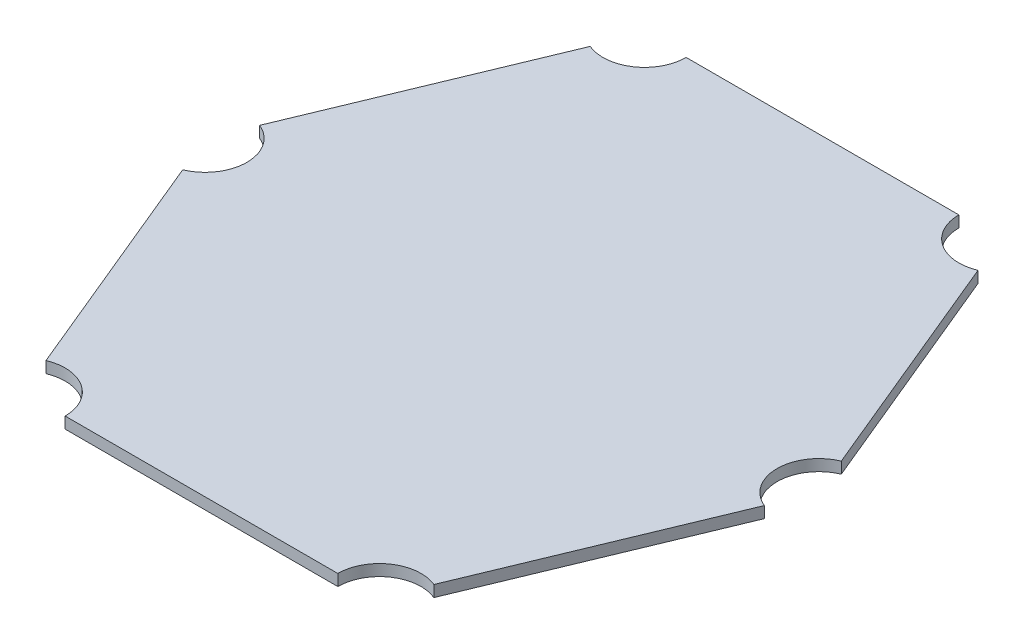
ISO-10303-21;
HEADER;
FILE_DESCRIPTION(('STEP AP214'),'2;1');
FILE_NAME('part.step','',(''),(''),'','','');
FILE_SCHEMA(('AUTOMOTIVE_DESIGN { 1 0 10303 214 1 1 1 1 }'));
ENDSEC;
DATA;
#1=APPLICATION_CONTEXT('core data for automotive mechanical design processes');
#2=APPLICATION_PROTOCOL_DEFINITION('international standard','automotive_design',2000,#1);
#3=PRODUCT_CONTEXT('',#1,'mechanical');
#4=PRODUCT('Part','Part','',(#3));
#5=PRODUCT_RELATED_PRODUCT_CATEGORY('part','',(#4));
#6=PRODUCT_DEFINITION_FORMATION('','',#4);
#7=PRODUCT_DEFINITION_CONTEXT('part definition',#1,'design');
#8=PRODUCT_DEFINITION('design','',#6,#7);
#9=PRODUCT_DEFINITION_SHAPE('','',#8);
#10=(LENGTH_UNIT() NAMED_UNIT(*) SI_UNIT(.MILLI.,.METRE.));
#11=(NAMED_UNIT(*) PLANE_ANGLE_UNIT() SI_UNIT($,.RADIAN.));
#12=(NAMED_UNIT(*) SI_UNIT($,.STERADIAN.) SOLID_ANGLE_UNIT());
#13=UNCERTAINTY_MEASURE_WITH_UNIT(LENGTH_MEASURE(1.E-05),#10,'distance_accuracy_value','');
#14=(GEOMETRIC_REPRESENTATION_CONTEXT(3) GLOBAL_UNCERTAINTY_ASSIGNED_CONTEXT((#13)) GLOBAL_UNIT_ASSIGNED_CONTEXT((#10,
#11,#12)) REPRESENTATION_CONTEXT('',''));
#15=CARTESIAN_POINT('',(0.,0.,0.));
#16=DIRECTION('',(0.,0.,1.));
#17=DIRECTION('',(1.,0.,0.));
#18=AXIS2_PLACEMENT_3D('',#15,#16,#17);
#19=CARTESIAN_POINT('',(47.,3.,82.));
#20=DIRECTION('',(-0.923742113571632,0.,-0.383015022700433));
#21=DIRECTION('',(-0.383015022700433,0.,0.923742113571632));
#22=AXIS2_PLACEMENT_3D('',#19,#20,#21);
#23=PLANE('',#22);
#24=DIRECTION('',(0.383015022700433,0.,-0.923742113571632));
#25=VECTOR('',#24,1.);
#26=CARTESIAN_POINT('',(47.,3.,82.));
#27=LINE('',#26,#25);
#28=CARTESIAN_POINT('',(51.2131652497048,3.,71.838836750712));
#29=VERTEX_POINT('',#28);
#30=CARTESIAN_POINT('',(76.7868347502953,3.,10.1611632492879));
#31=VERTEX_POINT('',#30);
#32=EDGE_CURVE('E168',#29,#31,#27,.T.);
#33=ORIENTED_EDGE('',*,*,#32,.F.);
#34=DIRECTION('',(0.,1.,0.));
#35=VECTOR('',#34,1.);
#36=CARTESIAN_POINT('',(51.2131652497048,0.,71.838836750712));
#37=LINE('',#36,#35);
#38=CARTESIAN_POINT('',(51.2131652497048,0.,71.838836750712));
#39=VERTEX_POINT('',#38);
#40=EDGE_CURVE('E207',#29,#39,#37,.F.);
#41=ORIENTED_EDGE('',*,*,#40,.T.);
#42=DIRECTION('',(0.383015022700433,0.,-0.923742113571632));
#43=VECTOR('',#42,1.);
#44=CARTESIAN_POINT('',(47.,0.,82.));
#45=LINE('',#44,#43);
#46=CARTESIAN_POINT('',(76.7868347502953,0.,10.1611632492879));
#47=VERTEX_POINT('',#46);
#48=EDGE_CURVE('E152',#39,#47,#45,.T.);
#49=ORIENTED_EDGE('',*,*,#48,.T.);
#50=DIRECTION('',(0.,1.,0.));
#51=VECTOR('',#50,1.);
#52=CARTESIAN_POINT('',(76.7868347502953,0.,10.1611632492879));
#53=LINE('',#52,#51);
#54=EDGE_CURVE('E131',#47,#31,#53,.T.);
#55=ORIENTED_EDGE('',*,*,#54,.T.);
#56=EDGE_LOOP('',(#33,#41,#49,#55));
#57=FACE_BOUND('',#56,.T.);
#58=ADVANCED_FACE('F39',(#57),#23,.F.);
#59=CARTESIAN_POINT('',(47.,3.,-82.));
#60=DIRECTION('',(-0.923742113571632,0.,0.383015022700433));
#61=DIRECTION('',(0.383015022700433,0.,0.923742113571632));
#62=AXIS2_PLACEMENT_3D('',#59,#60,#61);
#63=PLANE('',#62);
#64=DIRECTION('',(-0.383015022700433,0.,-0.923742113571632));
#65=VECTOR('',#64,1.);
#66=CARTESIAN_POINT('',(47.,0.,-82.));
#67=LINE('',#66,#65);
#68=CARTESIAN_POINT('',(76.7868347502953,0.,-10.1611632492879));
#69=VERTEX_POINT('',#68);
#70=CARTESIAN_POINT('',(51.2131652497048,0.,-71.838836750712));
#71=VERTEX_POINT('',#70);
#72=EDGE_CURVE('E143',#69,#71,#67,.T.);
#73=ORIENTED_EDGE('',*,*,#72,.T.);
#74=DIRECTION('',(0.,1.,0.));
#75=VECTOR('',#74,1.);
#76=CARTESIAN_POINT('',(51.2131652497048,0.,-71.838836750712));
#77=LINE('',#76,#75);
#78=CARTESIAN_POINT('',(51.2131652497048,3.,-71.838836750712));
#79=VERTEX_POINT('',#78);
#80=EDGE_CURVE('E52',#71,#79,#77,.T.);
#81=ORIENTED_EDGE('',*,*,#80,.T.);
#82=DIRECTION('',(-0.383015022700433,0.,-0.923742113571632));
#83=VECTOR('',#82,1.);
#84=CARTESIAN_POINT('',(47.,3.,-82.));
#85=LINE('',#84,#83);
#86=CARTESIAN_POINT('',(76.7868347502953,3.,-10.1611632492879));
#87=VERTEX_POINT('',#86);
#88=EDGE_CURVE('E145',#87,#79,#85,.T.);
#89=ORIENTED_EDGE('',*,*,#88,.F.);
#90=DIRECTION('',(0.,1.,0.));
#91=VECTOR('',#90,1.);
#92=CARTESIAN_POINT('',(76.7868347502953,0.,-10.1611632492879));
#93=LINE('',#92,#91);
#94=EDGE_CURVE('E128',#87,#69,#93,.F.);
#95=ORIENTED_EDGE('',*,*,#94,.T.);
#96=EDGE_LOOP('',(#73,#81,#89,#95));
#97=FACE_BOUND('',#96,.T.);
#98=ADVANCED_FACE('F142',(#97),#63,.F.);
#99=CARTESIAN_POINT('',(-47.,3.,-82.));
#100=DIRECTION('',(0.,0.,1.));
#101=DIRECTION('',(1.,0.,0.));
#102=AXIS2_PLACEMENT_3D('',#99,#100,#101);
#103=PLANE('',#102);
#104=DIRECTION('',(-1.,0.,0.));
#105=VECTOR('',#104,1.);
#106=CARTESIAN_POINT('',(-47.,3.,-82.));
#107=LINE('',#106,#105);
#108=CARTESIAN_POINT('',(36.,3.,-82.));
#109=VERTEX_POINT('',#108);
#110=CARTESIAN_POINT('',(-36.,3.,-82.));
#111=VERTEX_POINT('',#110);
#112=EDGE_CURVE('E183',#109,#111,#107,.T.);
#113=ORIENTED_EDGE('',*,*,#112,.F.);
#114=DIRECTION('',(0.,1.,0.));
#115=VECTOR('',#114,1.);
#116=CARTESIAN_POINT('',(36.,0.,-82.));
#117=LINE('',#116,#115);
#118=CARTESIAN_POINT('',(36.,0.,-82.));
#119=VERTEX_POINT('',#118);
#120=EDGE_CURVE('E195',#109,#119,#117,.F.);
#121=ORIENTED_EDGE('',*,*,#120,.T.);
#122=DIRECTION('',(-1.,0.,0.));
#123=VECTOR('',#122,1.);
#124=CARTESIAN_POINT('',(-47.,0.,-82.));
#125=LINE('',#124,#123);
#126=CARTESIAN_POINT('',(-36.,0.,-82.));
#127=VERTEX_POINT('',#126);
#128=EDGE_CURVE('E151',#119,#127,#125,.T.);
#129=ORIENTED_EDGE('',*,*,#128,.T.);
#130=DIRECTION('',(0.,1.,0.));
#131=VECTOR('',#130,1.);
#132=CARTESIAN_POINT('',(-36.,0.,-82.));
#133=LINE('',#132,#131);
#134=EDGE_CURVE('E60',#127,#111,#133,.T.);
#135=ORIENTED_EDGE('',*,*,#134,.T.);
#136=EDGE_LOOP('',(#113,#121,#129,#135));
#137=FACE_BOUND('',#136,.T.);
#138=ADVANCED_FACE('F243',(#137),#103,.F.);
#139=CARTESIAN_POINT('',(-47.,3.,-82.));
#140=DIRECTION('',(0.923742113571632,0.,0.383015022700433));
#141=DIRECTION('',(0.383015022700433,0.,-0.923742113571632));
#142=AXIS2_PLACEMENT_3D('',#139,#140,#141);
#143=PLANE('',#142);
#144=DIRECTION('',(-0.383015022700433,0.,0.923742113571632));
#145=VECTOR('',#144,1.);
#146=CARTESIAN_POINT('',(-47.,0.,-82.));
#147=LINE('',#146,#145);
#148=CARTESIAN_POINT('',(-51.2131652497048,0.,-71.838836750712));
#149=VERTEX_POINT('',#148);
#150=CARTESIAN_POINT('',(-76.7868347502952,0.,-10.161163249288));
#151=VERTEX_POINT('',#150);
#152=EDGE_CURVE('E155',#149,#151,#147,.T.);
#153=ORIENTED_EDGE('',*,*,#152,.T.);
#154=DIRECTION('',(0.,1.,0.));
#155=VECTOR('',#154,1.);
#156=CARTESIAN_POINT('',(-76.7868347502952,0.,-10.161163249288));
#157=LINE('',#156,#155);
#158=CARTESIAN_POINT('',(-76.7868347502952,3.,-10.161163249288));
#159=VERTEX_POINT('',#158);
#160=EDGE_CURVE('E157',#151,#159,#157,.T.);
#161=ORIENTED_EDGE('',*,*,#160,.T.);
#162=DIRECTION('',(-0.383015022700433,0.,0.923742113571632));
#163=VECTOR('',#162,1.);
#164=CARTESIAN_POINT('',(-47.,3.,-82.));
#165=LINE('',#164,#163);
#166=CARTESIAN_POINT('',(-51.2131652497048,3.,-71.838836750712));
#167=VERTEX_POINT('',#166);
#168=EDGE_CURVE('E178',#167,#159,#165,.T.);
#169=ORIENTED_EDGE('',*,*,#168,.F.);
#170=DIRECTION('',(0.,1.,0.));
#171=VECTOR('',#170,1.);
#172=CARTESIAN_POINT('',(-51.2131652497048,0.,-71.838836750712));
#173=LINE('',#172,#171);
#174=EDGE_CURVE('E199',#167,#149,#173,.F.);
#175=ORIENTED_EDGE('',*,*,#174,.T.);
#176=EDGE_LOOP('',(#153,#161,#169,#175));
#177=FACE_BOUND('',#176,.T.);
#178=ADVANCED_FACE('F234',(#177),#143,.F.);
#179=CARTESIAN_POINT('',(-47.,3.,82.));
#180=DIRECTION('',(0.923742113571632,0.,-0.383015022700433));
#181=DIRECTION('',(-0.383015022700433,0.,-0.923742113571632));
#182=AXIS2_PLACEMENT_3D('',#179,#180,#181);
#183=PLANE('',#182);
#184=DIRECTION('',(0.383015022700433,0.,0.923742113571632));
#185=VECTOR('',#184,1.);
#186=CARTESIAN_POINT('',(-47.,3.,82.));
#187=LINE('',#186,#185);
#188=CARTESIAN_POINT('',(-76.7868347502952,3.,10.161163249288));
#189=VERTEX_POINT('',#188);
#190=CARTESIAN_POINT('',(-51.2131652497048,3.,71.838836750712));
#191=VERTEX_POINT('',#190);
#192=EDGE_CURVE('E172',#189,#191,#187,.T.);
#193=ORIENTED_EDGE('',*,*,#192,.F.);
#194=DIRECTION('',(0.,1.,0.));
#195=VECTOR('',#194,1.);
#196=CARTESIAN_POINT('',(-76.7868347502952,0.,10.161163249288));
#197=LINE('',#196,#195);
#198=CARTESIAN_POINT('',(-76.7868347502952,0.,10.161163249288));
#199=VERTEX_POINT('',#198);
#200=EDGE_CURVE('E191',#189,#199,#197,.F.);
#201=ORIENTED_EDGE('',*,*,#200,.T.);
#202=DIRECTION('',(0.383015022700433,0.,0.923742113571632));
#203=VECTOR('',#202,1.);
#204=CARTESIAN_POINT('',(-47.,0.,82.));
#205=LINE('',#204,#203);
#206=CARTESIAN_POINT('',(-51.2131652497048,0.,71.838836750712));
#207=VERTEX_POINT('',#206);
#208=EDGE_CURVE('E163',#199,#207,#205,.T.);
#209=ORIENTED_EDGE('',*,*,#208,.T.);
#210=DIRECTION('',(0.,1.,0.));
#211=VECTOR('',#210,1.);
#212=CARTESIAN_POINT('',(-51.2131652497048,0.,71.838836750712));
#213=LINE('',#212,#211);
#214=EDGE_CURVE('E201',#207,#191,#213,.T.);
#215=ORIENTED_EDGE('',*,*,#214,.T.);
#216=EDGE_LOOP('',(#193,#201,#209,#215));
#217=FACE_BOUND('',#216,.T.);
#218=ADVANCED_FACE('F255',(#217),#183,.F.);
#219=CARTESIAN_POINT('',(-47.,3.,82.));
#220=DIRECTION('',(0.,0.,-1.));
#221=DIRECTION('',(-1.,0.,0.));
#222=AXIS2_PLACEMENT_3D('',#219,#220,#221);
#223=PLANE('',#222);
#224=DIRECTION('',(1.,0.,0.));
#225=VECTOR('',#224,1.);
#226=CARTESIAN_POINT('',(-47.,3.,82.));
#227=LINE('',#226,#225);
#228=CARTESIAN_POINT('',(-36.,3.,82.));
#229=VERTEX_POINT('',#228);
#230=CARTESIAN_POINT('',(36.,3.,82.));
#231=VERTEX_POINT('',#230);
#232=EDGE_CURVE('E169',#229,#231,#227,.T.);
#233=ORIENTED_EDGE('',*,*,#232,.F.);
#234=DIRECTION('',(0.,1.,0.));
#235=VECTOR('',#234,1.);
#236=CARTESIAN_POINT('',(-36.,0.,82.));
#237=LINE('',#236,#235);
#238=CARTESIAN_POINT('',(-36.,0.,82.));
#239=VERTEX_POINT('',#238);
#240=EDGE_CURVE('E204',#229,#239,#237,.F.);
#241=ORIENTED_EDGE('',*,*,#240,.T.);
#242=DIRECTION('',(1.,0.,0.));
#243=VECTOR('',#242,1.);
#244=CARTESIAN_POINT('',(-47.,0.,82.));
#245=LINE('',#244,#243);
#246=CARTESIAN_POINT('',(36.,0.,82.));
#247=VERTEX_POINT('',#246);
#248=EDGE_CURVE('E166',#239,#247,#245,.T.);
#249=ORIENTED_EDGE('',*,*,#248,.T.);
#250=DIRECTION('',(0.,1.,0.));
#251=VECTOR('',#250,1.);
#252=CARTESIAN_POINT('',(36.,0.,82.));
#253=LINE('',#252,#251);
#254=EDGE_CURVE('E210',#247,#231,#253,.T.);
#255=ORIENTED_EDGE('',*,*,#254,.T.);
#256=EDGE_LOOP('',(#233,#241,#249,#255));
#257=FACE_BOUND('',#256,.T.);
#258=ADVANCED_FACE('F250',(#257),#223,.F.);
#259=CARTESIAN_POINT('',(0.,3.,0.));
#260=DIRECTION('',(0.,-1.,0.));
#261=DIRECTION('',(0.,0.,-1.));
#262=AXIS2_PLACEMENT_3D('',#259,#260,#261);
#263=PLANE('',#262);
#264=ORIENTED_EDGE('',*,*,#168,.T.);
#265=CARTESIAN_POINT('',(-81.,3.,0.));
#266=DIRECTION('',(0.,1.,0.));
#267=DIRECTION('',(0.,0.,1.));
#268=AXIS2_PLACEMENT_3D('',#265,#266,#267);
#269=CIRCLE('',#268,11.);
#270=EDGE_CURVE('E227',#189,#159,#269,.T.);
#271=ORIENTED_EDGE('',*,*,#270,.F.);
#272=ORIENTED_EDGE('',*,*,#192,.T.);
#273=CARTESIAN_POINT('',(-47.,3.,82.));
#274=DIRECTION('',(0.,1.,0.));
#275=DIRECTION('',(0.,0.,1.));
#276=AXIS2_PLACEMENT_3D('',#273,#274,#275);
#277=CIRCLE('',#276,11.);
#278=EDGE_CURVE('E220',#229,#191,#277,.T.);
#279=ORIENTED_EDGE('',*,*,#278,.F.);
#280=ORIENTED_EDGE('',*,*,#232,.T.);
#281=CARTESIAN_POINT('',(47.,3.,82.));
#282=DIRECTION('',(0.,1.,0.));
#283=DIRECTION('',(0.,0.,1.));
#284=AXIS2_PLACEMENT_3D('',#281,#282,#283);
#285=CIRCLE('',#284,11.);
#286=EDGE_CURVE('E137',#29,#231,#285,.T.);
#287=ORIENTED_EDGE('',*,*,#286,.F.);
#288=ORIENTED_EDGE('',*,*,#32,.T.);
#289=CARTESIAN_POINT('',(81.,3.,0.));
#290=DIRECTION('',(0.,1.,0.));
#291=DIRECTION('',(0.,0.,1.));
#292=AXIS2_PLACEMENT_3D('',#289,#290,#291);
#293=CIRCLE('',#292,11.);
#294=EDGE_CURVE('E136',#87,#31,#293,.T.);
#295=ORIENTED_EDGE('',*,*,#294,.F.);
#296=ORIENTED_EDGE('',*,*,#88,.T.);
#297=CARTESIAN_POINT('',(47.,3.,-82.));
#298=DIRECTION('',(0.,1.,0.));
#299=DIRECTION('',(0.,0.,1.));
#300=AXIS2_PLACEMENT_3D('',#297,#298,#299);
#301=CIRCLE('',#300,11.);
#302=EDGE_CURVE('E217',#109,#79,#301,.T.);
#303=ORIENTED_EDGE('',*,*,#302,.F.);
#304=ORIENTED_EDGE('',*,*,#112,.T.);
#305=CARTESIAN_POINT('',(-47.,3.,-82.));
#306=DIRECTION('',(0.,1.,0.));
#307=DIRECTION('',(0.,0.,1.));
#308=AXIS2_PLACEMENT_3D('',#305,#306,#307);
#309=CIRCLE('',#308,11.);
#310=EDGE_CURVE('E214',#167,#111,#309,.T.);
#311=ORIENTED_EDGE('',*,*,#310,.F.);
#312=EDGE_LOOP('',(#264,#271,#272,#279,#280,#287,#288,#295,#296,#303,#304,#311));
#313=FACE_BOUND('',#312,.T.);
#314=ADVANCED_FACE('F238',(#313),#263,.F.);
#315=CARTESIAN_POINT('',(0.,0.,0.));
#316=DIRECTION('',(0.,-1.,0.));
#317=DIRECTION('',(0.,0.,-1.));
#318=AXIS2_PLACEMENT_3D('',#315,#316,#317);
#319=PLANE('',#318);
#320=CARTESIAN_POINT('',(-81.,0.,0.));
#321=DIRECTION('',(0.,1.,0.));
#322=DIRECTION('',(0.,0.,1.));
#323=AXIS2_PLACEMENT_3D('',#320,#321,#322);
#324=CIRCLE('',#323,11.);
#325=EDGE_CURVE('E146',#199,#151,#324,.T.);
#326=ORIENTED_EDGE('',*,*,#325,.T.);
#327=ORIENTED_EDGE('',*,*,#152,.F.);
#328=CARTESIAN_POINT('',(-47.,0.,-82.));
#329=DIRECTION('',(0.,-1.,0.));
#330=DIRECTION('',(0.,0.,-1.));
#331=AXIS2_PLACEMENT_3D('',#328,#329,#330);
#332=CIRCLE('',#331,11.);
#333=EDGE_CURVE('E46',#127,#149,#332,.T.);
#334=ORIENTED_EDGE('',*,*,#333,.F.);
#335=ORIENTED_EDGE('',*,*,#128,.F.);
#336=CARTESIAN_POINT('',(47.,0.,-82.));
#337=DIRECTION('',(0.,-1.,0.));
#338=DIRECTION('',(0.,0.,-1.));
#339=AXIS2_PLACEMENT_3D('',#336,#337,#338);
#340=CIRCLE('',#339,11.);
#341=EDGE_CURVE('E11',#71,#119,#340,.T.);
#342=ORIENTED_EDGE('',*,*,#341,.F.);
#343=ORIENTED_EDGE('',*,*,#72,.F.);
#344=CARTESIAN_POINT('',(81.,0.,0.));
#345=DIRECTION('',(0.,1.,0.));
#346=DIRECTION('',(0.,0.,1.));
#347=AXIS2_PLACEMENT_3D('',#344,#345,#346);
#348=CIRCLE('',#347,11.);
#349=EDGE_CURVE('E125',#69,#47,#348,.T.);
#350=ORIENTED_EDGE('',*,*,#349,.T.);
#351=ORIENTED_EDGE('',*,*,#48,.F.);
#352=CARTESIAN_POINT('',(47.,0.,82.));
#353=DIRECTION('',(0.,1.,0.));
#354=DIRECTION('',(0.,0.,1.));
#355=AXIS2_PLACEMENT_3D('',#352,#353,#354);
#356=CIRCLE('',#355,11.);
#357=EDGE_CURVE('E222',#39,#247,#356,.T.);
#358=ORIENTED_EDGE('',*,*,#357,.T.);
#359=ORIENTED_EDGE('',*,*,#248,.F.);
#360=CARTESIAN_POINT('',(-47.,0.,82.));
#361=DIRECTION('',(0.,1.,0.));
#362=DIRECTION('',(0.,0.,1.));
#363=AXIS2_PLACEMENT_3D('',#360,#361,#362);
#364=CIRCLE('',#363,11.);
#365=EDGE_CURVE('E216',#239,#207,#364,.T.);
#366=ORIENTED_EDGE('',*,*,#365,.T.);
#367=ORIENTED_EDGE('',*,*,#208,.F.);
#368=EDGE_LOOP('',(#326,#327,#334,#335,#342,#343,#350,#351,#358,#359,#366,#367));
#369=FACE_BOUND('',#368,.T.);
#370=ADVANCED_FACE('F149',(#369),#319,.T.);
#371=CARTESIAN_POINT('',(81.,0.,0.));
#372=DIRECTION('',(0.,1.,0.));
#373=DIRECTION('',(0.,0.,1.));
#374=AXIS2_PLACEMENT_3D('',#371,#372,#373);
#375=CYLINDRICAL_SURFACE('',#374,11.);
#376=ORIENTED_EDGE('',*,*,#349,.F.);
#377=ORIENTED_EDGE('',*,*,#94,.F.);
#378=ORIENTED_EDGE('',*,*,#294,.T.);
#379=ORIENTED_EDGE('',*,*,#54,.F.);
#380=EDGE_LOOP('',(#376,#377,#378,#379));
#381=FACE_BOUND('',#380,.T.);
#382=ADVANCED_FACE('F127',(#381),#375,.F.);
#383=CARTESIAN_POINT('',(47.,0.,82.));
#384=DIRECTION('',(0.,1.,0.));
#385=DIRECTION('',(0.,0.,1.));
#386=AXIS2_PLACEMENT_3D('',#383,#384,#385);
#387=CYLINDRICAL_SURFACE('',#386,11.);
#388=ORIENTED_EDGE('',*,*,#286,.T.);
#389=ORIENTED_EDGE('',*,*,#254,.F.);
#390=ORIENTED_EDGE('',*,*,#357,.F.);
#391=ORIENTED_EDGE('',*,*,#40,.F.);
#392=EDGE_LOOP('',(#388,#389,#390,#391));
#393=FACE_BOUND('',#392,.T.);
#394=ADVANCED_FACE('F286',(#393),#387,.F.);
#395=CARTESIAN_POINT('',(-47.,0.,82.));
#396=DIRECTION('',(0.,1.,0.));
#397=DIRECTION('',(0.,0.,1.));
#398=AXIS2_PLACEMENT_3D('',#395,#396,#397);
#399=CYLINDRICAL_SURFACE('',#398,11.);
#400=ORIENTED_EDGE('',*,*,#365,.F.);
#401=ORIENTED_EDGE('',*,*,#240,.F.);
#402=ORIENTED_EDGE('',*,*,#278,.T.);
#403=ORIENTED_EDGE('',*,*,#214,.F.);
#404=EDGE_LOOP('',(#400,#401,#402,#403));
#405=FACE_BOUND('',#404,.T.);
#406=ADVANCED_FACE('F252',(#405),#399,.F.);
#407=CARTESIAN_POINT('',(-47.,0.,-82.));
#408=DIRECTION('',(0.,1.,0.));
#409=DIRECTION('',(0.,0.,1.));
#410=AXIS2_PLACEMENT_3D('',#407,#408,#409);
#411=CYLINDRICAL_SURFACE('',#410,11.);
#412=ORIENTED_EDGE('',*,*,#333,.T.);
#413=ORIENTED_EDGE('',*,*,#174,.F.);
#414=ORIENTED_EDGE('',*,*,#310,.T.);
#415=ORIENTED_EDGE('',*,*,#134,.F.);
#416=EDGE_LOOP('',(#412,#413,#414,#415));
#417=FACE_BOUND('',#416,.T.);
#418=ADVANCED_FACE('F237',(#417),#411,.F.);
#419=CARTESIAN_POINT('',(47.,0.,-82.));
#420=DIRECTION('',(0.,1.,0.));
#421=DIRECTION('',(0.,0.,1.));
#422=AXIS2_PLACEMENT_3D('',#419,#420,#421);
#423=CYLINDRICAL_SURFACE('',#422,11.);
#424=ORIENTED_EDGE('',*,*,#341,.T.);
#425=ORIENTED_EDGE('',*,*,#120,.F.);
#426=ORIENTED_EDGE('',*,*,#302,.T.);
#427=ORIENTED_EDGE('',*,*,#80,.F.);
#428=EDGE_LOOP('',(#424,#425,#426,#427));
#429=FACE_BOUND('',#428,.T.);
#430=ADVANCED_FACE('F244',(#429),#423,.F.);
#431=CARTESIAN_POINT('',(-81.,0.,0.));
#432=DIRECTION('',(0.,1.,0.));
#433=DIRECTION('',(0.,0.,1.));
#434=AXIS2_PLACEMENT_3D('',#431,#432,#433);
#435=CYLINDRICAL_SURFACE('',#434,11.);
#436=ORIENTED_EDGE('',*,*,#325,.F.);
#437=ORIENTED_EDGE('',*,*,#200,.F.);
#438=ORIENTED_EDGE('',*,*,#270,.T.);
#439=ORIENTED_EDGE('',*,*,#160,.F.);
#440=EDGE_LOOP('',(#436,#437,#438,#439));
#441=FACE_BOUND('',#440,.T.);
#442=ADVANCED_FACE('F256',(#441),#435,.F.);
#443=CLOSED_SHELL('',(#58,#98,#138,#178,#218,#258,#314,#370,#382,#394,#406,#418,#430,#442));
#444=MANIFOLD_SOLID_BREP('B2',#443);
#445=ADVANCED_BREP_SHAPE_REPRESENTATION('',(#18,#444),#14);
#446=SHAPE_DEFINITION_REPRESENTATION(#9,#445);
ENDSEC;
END-ISO-10303-21;
